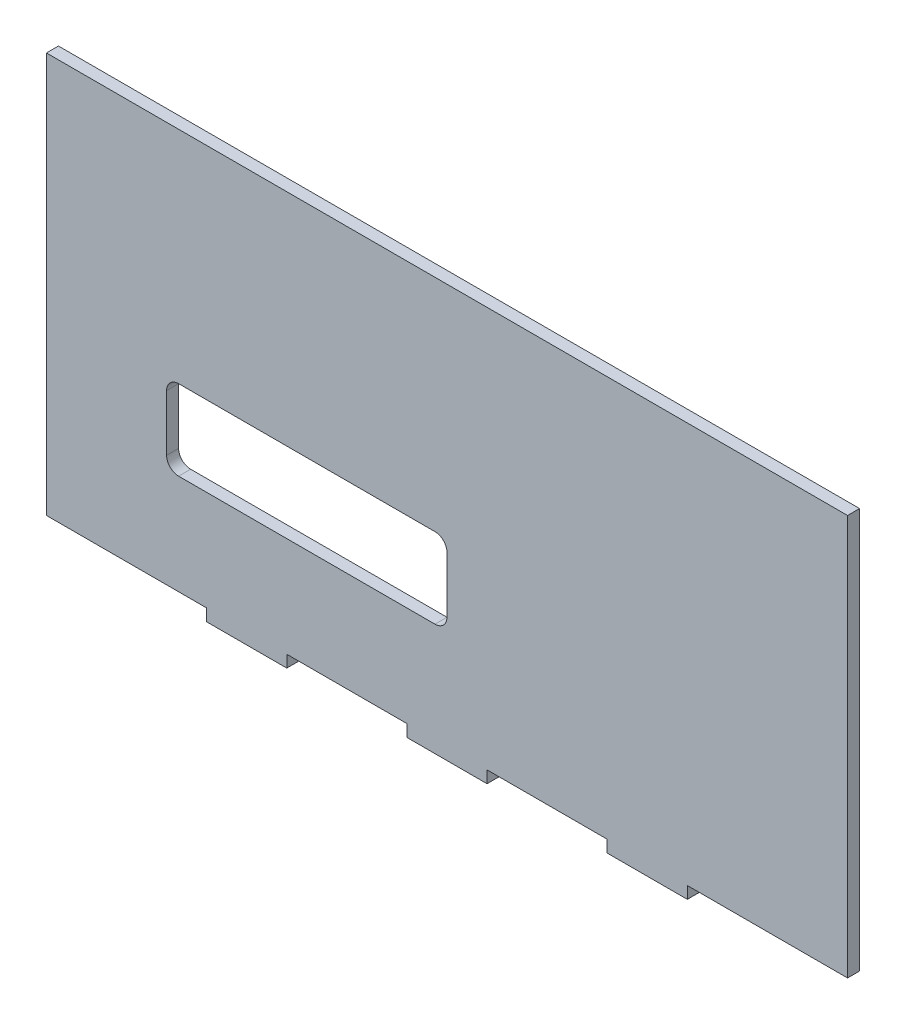
ISO-10303-21;
HEADER;
FILE_DESCRIPTION(('STEP AP214'),'2;1');
FILE_NAME('part.step','',(''),(''),'','','');
FILE_SCHEMA(('AUTOMOTIVE_DESIGN { 1 0 10303 214 1 1 1 1 }'));
ENDSEC;
DATA;
#1=APPLICATION_CONTEXT('core data for automotive mechanical design processes');
#2=APPLICATION_PROTOCOL_DEFINITION('international standard','automotive_design',2000,#1);
#3=PRODUCT_CONTEXT('',#1,'mechanical');
#4=PRODUCT('Part','Part','',(#3));
#5=PRODUCT_RELATED_PRODUCT_CATEGORY('part','',(#4));
#6=PRODUCT_DEFINITION_FORMATION('','',#4);
#7=PRODUCT_DEFINITION_CONTEXT('part definition',#1,'design');
#8=PRODUCT_DEFINITION('design','',#6,#7);
#9=PRODUCT_DEFINITION_SHAPE('','',#8);
#10=(LENGTH_UNIT() NAMED_UNIT(*) SI_UNIT(.MILLI.,.METRE.));
#11=(NAMED_UNIT(*) PLANE_ANGLE_UNIT() SI_UNIT($,.RADIAN.));
#12=(NAMED_UNIT(*) SI_UNIT($,.STERADIAN.) SOLID_ANGLE_UNIT());
#13=UNCERTAINTY_MEASURE_WITH_UNIT(LENGTH_MEASURE(1.E-05),#10,'distance_accuracy_value','');
#14=(GEOMETRIC_REPRESENTATION_CONTEXT(3) GLOBAL_UNCERTAINTY_ASSIGNED_CONTEXT((#13)) GLOBAL_UNIT_ASSIGNED_CONTEXT((#10,
#11,#12)) REPRESENTATION_CONTEXT('',''));
#15=CARTESIAN_POINT('',(0.,0.,0.));
#16=DIRECTION('',(0.,0.,1.));
#17=DIRECTION('',(1.,0.,0.));
#18=AXIS2_PLACEMENT_3D('',#15,#16,#17);
#19=CARTESIAN_POINT('',(0.,0.,3.));
#20=DIRECTION('',(0.,0.,-1.));
#21=DIRECTION('',(-1.,0.,0.));
#22=AXIS2_PLACEMENT_3D('',#19,#20,#21);
#23=PLANE('',#22);
#24=DIRECTION('',(0.,1.,0.));
#25=VECTOR('',#24,1.);
#26=CARTESIAN_POINT('',(100.,-50.,3.));
#27=LINE('',#26,#25);
#28=CARTESIAN_POINT('',(100.,-50.,3.));
#29=VERTEX_POINT('',#28);
#30=CARTESIAN_POINT('',(100.,50.,3.));
#31=VERTEX_POINT('',#30);
#32=EDGE_CURVE('E263',#29,#31,#27,.T.);
#33=ORIENTED_EDGE('',*,*,#32,.T.);
#34=DIRECTION('',(-1.,0.,0.));
#35=VECTOR('',#34,1.);
#36=CARTESIAN_POINT('',(-100.,50.,3.));
#37=LINE('',#36,#35);
#38=CARTESIAN_POINT('',(-100.,50.,3.));
#39=VERTEX_POINT('',#38);
#40=EDGE_CURVE('E266',#31,#39,#37,.T.);
#41=ORIENTED_EDGE('',*,*,#40,.T.);
#42=DIRECTION('',(0.,-1.,0.));
#43=VECTOR('',#42,1.);
#44=CARTESIAN_POINT('',(-100.,-50.,3.));
#45=LINE('',#44,#43);
#46=CARTESIAN_POINT('',(-100.,-50.,3.));
#47=VERTEX_POINT('',#46);
#48=EDGE_CURVE('E269',#39,#47,#45,.T.);
#49=ORIENTED_EDGE('',*,*,#48,.T.);
#50=DIRECTION('',(1.,0.,0.));
#51=VECTOR('',#50,1.);
#52=CARTESIAN_POINT('',(-100.,-50.,3.));
#53=LINE('',#52,#51);
#54=CARTESIAN_POINT('',(-60.,-50.,3.));
#55=VERTEX_POINT('',#54);
#56=EDGE_CURVE('E271',#47,#55,#53,.T.);
#57=ORIENTED_EDGE('',*,*,#56,.T.);
#58=DIRECTION('',(0.,-1.,0.));
#59=VECTOR('',#58,1.);
#60=CARTESIAN_POINT('',(-60.,-53.,3.));
#61=LINE('',#60,#59);
#62=CARTESIAN_POINT('',(-60.,-53.,3.));
#63=VERTEX_POINT('',#62);
#64=EDGE_CURVE('E273',#55,#63,#61,.T.);
#65=ORIENTED_EDGE('',*,*,#64,.T.);
#66=DIRECTION('',(1.,0.,0.));
#67=VECTOR('',#66,1.);
#68=CARTESIAN_POINT('',(-60.,-53.,3.));
#69=LINE('',#68,#67);
#70=CARTESIAN_POINT('',(-40.,-53.,3.));
#71=VERTEX_POINT('',#70);
#72=EDGE_CURVE('E275',#63,#71,#69,.T.);
#73=ORIENTED_EDGE('',*,*,#72,.T.);
#74=DIRECTION('',(0.,1.,0.));
#75=VECTOR('',#74,1.);
#76=CARTESIAN_POINT('',(-40.,-53.,3.));
#77=LINE('',#76,#75);
#78=CARTESIAN_POINT('',(-40.,-50.,3.));
#79=VERTEX_POINT('',#78);
#80=EDGE_CURVE('E277',#71,#79,#77,.T.);
#81=ORIENTED_EDGE('',*,*,#80,.T.);
#82=DIRECTION('',(1.,0.,0.));
#83=VECTOR('',#82,1.);
#84=CARTESIAN_POINT('',(-40.,-50.,3.));
#85=LINE('',#84,#83);
#86=CARTESIAN_POINT('',(-10.,-50.,3.));
#87=VERTEX_POINT('',#86);
#88=EDGE_CURVE('E279',#79,#87,#85,.T.);
#89=ORIENTED_EDGE('',*,*,#88,.T.);
#90=DIRECTION('',(0.,-1.,0.));
#91=VECTOR('',#90,1.);
#92=CARTESIAN_POINT('',(-10.,-53.,3.));
#93=LINE('',#92,#91);
#94=CARTESIAN_POINT('',(-10.,-53.,3.));
#95=VERTEX_POINT('',#94);
#96=EDGE_CURVE('E281',#87,#95,#93,.T.);
#97=ORIENTED_EDGE('',*,*,#96,.T.);
#98=DIRECTION('',(1.,0.,0.));
#99=VECTOR('',#98,1.);
#100=CARTESIAN_POINT('',(-10.,-53.,3.));
#101=LINE('',#100,#99);
#102=CARTESIAN_POINT('',(10.,-53.,3.));
#103=VERTEX_POINT('',#102);
#104=EDGE_CURVE('E283',#95,#103,#101,.T.);
#105=ORIENTED_EDGE('',*,*,#104,.T.);
#106=DIRECTION('',(0.,1.,0.));
#107=VECTOR('',#106,1.);
#108=CARTESIAN_POINT('',(10.,-53.,3.));
#109=LINE('',#108,#107);
#110=CARTESIAN_POINT('',(10.,-50.,3.));
#111=VERTEX_POINT('',#110);
#112=EDGE_CURVE('E285',#103,#111,#109,.T.);
#113=ORIENTED_EDGE('',*,*,#112,.T.);
#114=DIRECTION('',(1.,0.,0.));
#115=VECTOR('',#114,1.);
#116=CARTESIAN_POINT('',(10.,-50.,3.));
#117=LINE('',#116,#115);
#118=CARTESIAN_POINT('',(40.,-50.,3.));
#119=VERTEX_POINT('',#118);
#120=EDGE_CURVE('E287',#111,#119,#117,.T.);
#121=ORIENTED_EDGE('',*,*,#120,.T.);
#122=DIRECTION('',(0.,-1.,0.));
#123=VECTOR('',#122,1.);
#124=CARTESIAN_POINT('',(40.,-53.,3.));
#125=LINE('',#124,#123);
#126=CARTESIAN_POINT('',(40.,-53.,3.));
#127=VERTEX_POINT('',#126);
#128=EDGE_CURVE('E289',#119,#127,#125,.T.);
#129=ORIENTED_EDGE('',*,*,#128,.T.);
#130=DIRECTION('',(1.,0.,0.));
#131=VECTOR('',#130,1.);
#132=CARTESIAN_POINT('',(40.,-53.,3.));
#133=LINE('',#132,#131);
#134=CARTESIAN_POINT('',(60.,-53.,3.));
#135=VERTEX_POINT('',#134);
#136=EDGE_CURVE('E291',#127,#135,#133,.T.);
#137=ORIENTED_EDGE('',*,*,#136,.T.);
#138=DIRECTION('',(0.,1.,0.));
#139=VECTOR('',#138,1.);
#140=CARTESIAN_POINT('',(60.,-53.,3.));
#141=LINE('',#140,#139);
#142=CARTESIAN_POINT('',(60.,-50.,3.));
#143=VERTEX_POINT('',#142);
#144=EDGE_CURVE('E293',#135,#143,#141,.T.);
#145=ORIENTED_EDGE('',*,*,#144,.T.);
#146=DIRECTION('',(1.,0.,0.));
#147=VECTOR('',#146,1.);
#148=CARTESIAN_POINT('',(60.,-50.,3.));
#149=LINE('',#148,#147);
#150=EDGE_CURVE('E295',#143,#29,#149,.T.);
#151=ORIENTED_EDGE('',*,*,#150,.T.);
#152=EDGE_LOOP('',(#33,#41,#49,#57,#65,#73,#81,#89,#97,#105,#113,#121,#129,#137,#145,#151));
#153=FACE_BOUND('',#152,.T.);
#154=CARTESIAN_POINT('',(-67.,-8.00000000000001,3.));
#155=DIRECTION('',(0.,0.,1.));
#156=DIRECTION('',(-1.,0.,0.));
#157=AXIS2_PLACEMENT_3D('',#154,#155,#156);
#158=CIRCLE('',#157,3.);
#159=CARTESIAN_POINT('',(-67.,-5.00000000000001,3.));
#160=VERTEX_POINT('',#159);
#161=CARTESIAN_POINT('',(-70.,-8.00000000000003,3.));
#162=VERTEX_POINT('',#161);
#163=EDGE_CURVE('E198',#160,#162,#158,.T.);
#164=ORIENTED_EDGE('',*,*,#163,.F.);
#165=DIRECTION('',(-1.,0.,0.));
#166=VECTOR('',#165,1.);
#167=CARTESIAN_POINT('',(-67.,-5.00000000000001,3.));
#168=LINE('',#167,#166);
#169=CARTESIAN_POINT('',(-3.00000000000005,-5.00000000000001,3.));
#170=VERTEX_POINT('',#169);
#171=EDGE_CURVE('E231',#170,#160,#168,.T.);
#172=ORIENTED_EDGE('',*,*,#171,.F.);
#173=CARTESIAN_POINT('',(-3.00000000000003,-8.00000000000001,3.));
#174=DIRECTION('',(0.,0.,1.));
#175=DIRECTION('',(-1.,0.,0.));
#176=AXIS2_PLACEMENT_3D('',#173,#174,#175);
#177=CIRCLE('',#176,3.);
#178=CARTESIAN_POINT('',(0.,-8.00000000000003,3.));
#179=VERTEX_POINT('',#178);
#180=EDGE_CURVE('E229',#179,#170,#177,.T.);
#181=ORIENTED_EDGE('',*,*,#180,.F.);
#182=DIRECTION('',(0.,1.,0.));
#183=VECTOR('',#182,1.);
#184=CARTESIAN_POINT('',(0.,-22.,3.));
#185=LINE('',#184,#183);
#186=CARTESIAN_POINT('',(0.,-22.,3.));
#187=VERTEX_POINT('',#186);
#188=EDGE_CURVE('E227',#187,#179,#185,.T.);
#189=ORIENTED_EDGE('',*,*,#188,.F.);
#190=CARTESIAN_POINT('',(-3.00000000000003,-22.,3.));
#191=DIRECTION('',(0.,0.,1.));
#192=DIRECTION('',(1.,0.,0.));
#193=AXIS2_PLACEMENT_3D('',#190,#191,#192);
#194=CIRCLE('',#193,3.);
#195=CARTESIAN_POINT('',(-3.00000000000005,-25.,3.));
#196=VERTEX_POINT('',#195);
#197=EDGE_CURVE('E225',#196,#187,#194,.T.);
#198=ORIENTED_EDGE('',*,*,#197,.F.);
#199=DIRECTION('',(1.,0.,0.));
#200=VECTOR('',#199,1.);
#201=CARTESIAN_POINT('',(-67.,-25.,3.));
#202=LINE('',#201,#200);
#203=CARTESIAN_POINT('',(-67.,-25.,3.));
#204=VERTEX_POINT('',#203);
#205=EDGE_CURVE('E221',#204,#196,#202,.T.);
#206=ORIENTED_EDGE('',*,*,#205,.F.);
#207=CARTESIAN_POINT('',(-67.,-22.,3.));
#208=DIRECTION('',(0.,0.,1.));
#209=DIRECTION('',(1.,0.,0.));
#210=AXIS2_PLACEMENT_3D('',#207,#208,#209);
#211=CIRCLE('',#210,3.);
#212=CARTESIAN_POINT('',(-70.,-22.,3.));
#213=VERTEX_POINT('',#212);
#214=EDGE_CURVE('E219',#213,#204,#211,.T.);
#215=ORIENTED_EDGE('',*,*,#214,.F.);
#216=DIRECTION('',(0.,-1.,0.));
#217=VECTOR('',#216,1.);
#218=CARTESIAN_POINT('',(-70.,-22.,3.));
#219=LINE('',#218,#217);
#220=EDGE_CURVE('E206',#162,#213,#219,.T.);
#221=ORIENTED_EDGE('',*,*,#220,.F.);
#222=EDGE_LOOP('',(#164,#172,#181,#189,#198,#206,#215,#221));
#223=FACE_BOUND('',#222,.T.);
#224=ADVANCED_FACE('F37',(#153,#223),#23,.F.);
#225=CARTESIAN_POINT('',(0.,0.,0.));
#226=DIRECTION('',(0.,0.,-1.));
#227=DIRECTION('',(-1.,0.,0.));
#228=AXIS2_PLACEMENT_3D('',#225,#226,#227);
#229=PLANE('',#228);
#230=DIRECTION('',(0.,1.,0.));
#231=VECTOR('',#230,1.);
#232=CARTESIAN_POINT('',(100.,-50.,0.));
#233=LINE('',#232,#231);
#234=CARTESIAN_POINT('',(100.,-50.,0.));
#235=VERTEX_POINT('',#234);
#236=CARTESIAN_POINT('',(100.,50.,0.));
#237=VERTEX_POINT('',#236);
#238=EDGE_CURVE('E214',#235,#237,#233,.T.);
#239=ORIENTED_EDGE('',*,*,#238,.F.);
#240=DIRECTION('',(1.,0.,0.));
#241=VECTOR('',#240,1.);
#242=CARTESIAN_POINT('',(60.,-50.,0.));
#243=LINE('',#242,#241);
#244=CARTESIAN_POINT('',(60.,-50.,0.));
#245=VERTEX_POINT('',#244);
#246=EDGE_CURVE('E267',#245,#235,#243,.T.);
#247=ORIENTED_EDGE('',*,*,#246,.F.);
#248=DIRECTION('',(0.,1.,0.));
#249=VECTOR('',#248,1.);
#250=CARTESIAN_POINT('',(60.,-53.,0.));
#251=LINE('',#250,#249);
#252=CARTESIAN_POINT('',(60.,-53.,0.));
#253=VERTEX_POINT('',#252);
#254=EDGE_CURVE('E326',#253,#245,#251,.T.);
#255=ORIENTED_EDGE('',*,*,#254,.F.);
#256=DIRECTION('',(1.,0.,0.));
#257=VECTOR('',#256,1.);
#258=CARTESIAN_POINT('',(40.,-53.,0.));
#259=LINE('',#258,#257);
#260=CARTESIAN_POINT('',(40.,-53.,0.));
#261=VERTEX_POINT('',#260);
#262=EDGE_CURVE('E324',#261,#253,#259,.T.);
#263=ORIENTED_EDGE('',*,*,#262,.F.);
#264=DIRECTION('',(0.,-1.,0.));
#265=VECTOR('',#264,1.);
#266=CARTESIAN_POINT('',(40.,-53.,0.));
#267=LINE('',#266,#265);
#268=CARTESIAN_POINT('',(40.,-50.,0.));
#269=VERTEX_POINT('',#268);
#270=EDGE_CURVE('E322',#269,#261,#267,.T.);
#271=ORIENTED_EDGE('',*,*,#270,.F.);
#272=DIRECTION('',(1.,0.,0.));
#273=VECTOR('',#272,1.);
#274=CARTESIAN_POINT('',(10.,-50.,0.));
#275=LINE('',#274,#273);
#276=CARTESIAN_POINT('',(10.,-50.,0.));
#277=VERTEX_POINT('',#276);
#278=EDGE_CURVE('E320',#277,#269,#275,.T.);
#279=ORIENTED_EDGE('',*,*,#278,.F.);
#280=DIRECTION('',(0.,1.,0.));
#281=VECTOR('',#280,1.);
#282=CARTESIAN_POINT('',(10.,-53.,0.));
#283=LINE('',#282,#281);
#284=CARTESIAN_POINT('',(10.,-53.,0.));
#285=VERTEX_POINT('',#284);
#286=EDGE_CURVE('E318',#285,#277,#283,.T.);
#287=ORIENTED_EDGE('',*,*,#286,.F.);
#288=DIRECTION('',(1.,0.,0.));
#289=VECTOR('',#288,1.);
#290=CARTESIAN_POINT('',(-10.,-53.,0.));
#291=LINE('',#290,#289);
#292=CARTESIAN_POINT('',(-10.,-53.,0.));
#293=VERTEX_POINT('',#292);
#294=EDGE_CURVE('E316',#293,#285,#291,.T.);
#295=ORIENTED_EDGE('',*,*,#294,.F.);
#296=DIRECTION('',(0.,-1.,0.));
#297=VECTOR('',#296,1.);
#298=CARTESIAN_POINT('',(-10.,-53.,0.));
#299=LINE('',#298,#297);
#300=CARTESIAN_POINT('',(-10.,-50.,0.));
#301=VERTEX_POINT('',#300);
#302=EDGE_CURVE('E314',#301,#293,#299,.T.);
#303=ORIENTED_EDGE('',*,*,#302,.F.);
#304=DIRECTION('',(1.,0.,0.));
#305=VECTOR('',#304,1.);
#306=CARTESIAN_POINT('',(-40.,-50.,0.));
#307=LINE('',#306,#305);
#308=CARTESIAN_POINT('',(-40.,-50.,0.));
#309=VERTEX_POINT('',#308);
#310=EDGE_CURVE('E312',#309,#301,#307,.T.);
#311=ORIENTED_EDGE('',*,*,#310,.F.);
#312=DIRECTION('',(0.,1.,0.));
#313=VECTOR('',#312,1.);
#314=CARTESIAN_POINT('',(-40.,-53.,0.));
#315=LINE('',#314,#313);
#316=CARTESIAN_POINT('',(-40.,-53.,0.));
#317=VERTEX_POINT('',#316);
#318=EDGE_CURVE('E310',#317,#309,#315,.T.);
#319=ORIENTED_EDGE('',*,*,#318,.F.);
#320=DIRECTION('',(1.,0.,0.));
#321=VECTOR('',#320,1.);
#322=CARTESIAN_POINT('',(-60.,-53.,0.));
#323=LINE('',#322,#321);
#324=CARTESIAN_POINT('',(-60.,-53.,0.));
#325=VERTEX_POINT('',#324);
#326=EDGE_CURVE('E308',#325,#317,#323,.T.);
#327=ORIENTED_EDGE('',*,*,#326,.F.);
#328=DIRECTION('',(0.,-1.,0.));
#329=VECTOR('',#328,1.);
#330=CARTESIAN_POINT('',(-60.,-53.,0.));
#331=LINE('',#330,#329);
#332=CARTESIAN_POINT('',(-60.,-50.,0.));
#333=VERTEX_POINT('',#332);
#334=EDGE_CURVE('E306',#333,#325,#331,.T.);
#335=ORIENTED_EDGE('',*,*,#334,.F.);
#336=DIRECTION('',(1.,0.,0.));
#337=VECTOR('',#336,1.);
#338=CARTESIAN_POINT('',(-100.,-50.,0.));
#339=LINE('',#338,#337);
#340=CARTESIAN_POINT('',(-100.,-50.,0.));
#341=VERTEX_POINT('',#340);
#342=EDGE_CURVE('E304',#341,#333,#339,.T.);
#343=ORIENTED_EDGE('',*,*,#342,.F.);
#344=DIRECTION('',(0.,-1.,0.));
#345=VECTOR('',#344,1.);
#346=CARTESIAN_POINT('',(-100.,-50.,0.));
#347=LINE('',#346,#345);
#348=CARTESIAN_POINT('',(-100.,50.,0.));
#349=VERTEX_POINT('',#348);
#350=EDGE_CURVE('E302',#349,#341,#347,.T.);
#351=ORIENTED_EDGE('',*,*,#350,.F.);
#352=DIRECTION('',(-1.,0.,0.));
#353=VECTOR('',#352,1.);
#354=CARTESIAN_POINT('',(-100.,50.,0.));
#355=LINE('',#354,#353);
#356=EDGE_CURVE('E300',#237,#349,#355,.T.);
#357=ORIENTED_EDGE('',*,*,#356,.F.);
#358=EDGE_LOOP('',(#239,#247,#255,#263,#271,#279,#287,#295,#303,#311,#319,#327,#335,#343,#351,#357));
#359=FACE_BOUND('',#358,.T.);
#360=DIRECTION('',(-1.,0.,0.));
#361=VECTOR('',#360,1.);
#362=CARTESIAN_POINT('',(-67.,-5.00000000000001,0.));
#363=LINE('',#362,#361);
#364=CARTESIAN_POINT('',(-3.00000000000005,-5.00000000000001,0.));
#365=VERTEX_POINT('',#364);
#366=CARTESIAN_POINT('',(-67.,-5.00000000000001,0.));
#367=VERTEX_POINT('',#366);
#368=EDGE_CURVE('E207',#365,#367,#363,.T.);
#369=ORIENTED_EDGE('',*,*,#368,.T.);
#370=CARTESIAN_POINT('',(-67.,-8.00000000000001,0.));
#371=DIRECTION('',(0.,0.,1.));
#372=DIRECTION('',(-1.,0.,0.));
#373=AXIS2_PLACEMENT_3D('',#370,#371,#372);
#374=CIRCLE('',#373,3.);
#375=CARTESIAN_POINT('',(-70.,-8.00000000000003,0.));
#376=VERTEX_POINT('',#375);
#377=EDGE_CURVE('E60',#367,#376,#374,.T.);
#378=ORIENTED_EDGE('',*,*,#377,.T.);
#379=DIRECTION('',(0.,-1.,0.));
#380=VECTOR('',#379,1.);
#381=CARTESIAN_POINT('',(-70.,-22.,0.));
#382=LINE('',#381,#380);
#383=CARTESIAN_POINT('',(-70.,-22.,0.));
#384=VERTEX_POINT('',#383);
#385=EDGE_CURVE('E213',#376,#384,#382,.T.);
#386=ORIENTED_EDGE('',*,*,#385,.T.);
#387=CARTESIAN_POINT('',(-67.,-22.,0.));
#388=DIRECTION('',(0.,0.,1.));
#389=DIRECTION('',(1.,0.,0.));
#390=AXIS2_PLACEMENT_3D('',#387,#388,#389);
#391=CIRCLE('',#390,3.);
#392=CARTESIAN_POINT('',(-67.,-25.,0.));
#393=VERTEX_POINT('',#392);
#394=EDGE_CURVE('E235',#384,#393,#391,.T.);
#395=ORIENTED_EDGE('',*,*,#394,.T.);
#396=DIRECTION('',(1.,0.,0.));
#397=VECTOR('',#396,1.);
#398=CARTESIAN_POINT('',(-67.,-25.,0.));
#399=LINE('',#398,#397);
#400=CARTESIAN_POINT('',(-3.00000000000005,-25.,0.));
#401=VERTEX_POINT('',#400);
#402=EDGE_CURVE('E238',#393,#401,#399,.T.);
#403=ORIENTED_EDGE('',*,*,#402,.T.);
#404=CARTESIAN_POINT('',(-3.00000000000003,-22.,0.));
#405=DIRECTION('',(0.,0.,1.));
#406=DIRECTION('',(1.,0.,0.));
#407=AXIS2_PLACEMENT_3D('',#404,#405,#406);
#408=CIRCLE('',#407,3.);
#409=CARTESIAN_POINT('',(0.,-22.,0.));
#410=VERTEX_POINT('',#409);
#411=EDGE_CURVE('E241',#401,#410,#408,.T.);
#412=ORIENTED_EDGE('',*,*,#411,.T.);
#413=DIRECTION('',(0.,1.,0.));
#414=VECTOR('',#413,1.);
#415=CARTESIAN_POINT('',(0.,-22.,0.));
#416=LINE('',#415,#414);
#417=CARTESIAN_POINT('',(0.,-8.00000000000003,0.));
#418=VERTEX_POINT('',#417);
#419=EDGE_CURVE('E244',#410,#418,#416,.T.);
#420=ORIENTED_EDGE('',*,*,#419,.T.);
#421=CARTESIAN_POINT('',(-3.00000000000003,-8.00000000000001,0.));
#422=DIRECTION('',(0.,0.,1.));
#423=DIRECTION('',(-1.,0.,0.));
#424=AXIS2_PLACEMENT_3D('',#421,#422,#423);
#425=CIRCLE('',#424,3.);
#426=EDGE_CURVE('E247',#418,#365,#425,.T.);
#427=ORIENTED_EDGE('',*,*,#426,.T.);
#428=EDGE_LOOP('',(#369,#378,#386,#395,#403,#412,#420,#427));
#429=FACE_BOUND('',#428,.T.);
#430=ADVANCED_FACE('F380',(#359,#429),#229,.T.);
#431=CARTESIAN_POINT('',(100.,-50.,3.));
#432=DIRECTION('',(-1.,0.,0.));
#433=DIRECTION('',(0.,0.,1.));
#434=AXIS2_PLACEMENT_3D('',#431,#432,#433);
#435=PLANE('',#434);
#436=ORIENTED_EDGE('',*,*,#238,.T.);
#437=DIRECTION('',(0.,0.,-1.));
#438=VECTOR('',#437,1.);
#439=CARTESIAN_POINT('',(100.,50.,3.));
#440=LINE('',#439,#438);
#441=EDGE_CURVE('E11',#31,#237,#440,.T.);
#442=ORIENTED_EDGE('',*,*,#441,.F.);
#443=ORIENTED_EDGE('',*,*,#32,.F.);
#444=DIRECTION('',(0.,0.,-1.));
#445=VECTOR('',#444,1.);
#446=CARTESIAN_POINT('',(100.,-50.,3.));
#447=LINE('',#446,#445);
#448=EDGE_CURVE('E297',#29,#235,#447,.T.);
#449=ORIENTED_EDGE('',*,*,#448,.T.);
#450=EDGE_LOOP('',(#436,#442,#443,#449));
#451=FACE_BOUND('',#450,.T.);
#452=ADVANCED_FACE('F39',(#451),#435,.F.);
#453=CARTESIAN_POINT('',(-100.,50.,3.));
#454=DIRECTION('',(0.,-1.,0.));
#455=DIRECTION('',(0.,0.,-1.));
#456=AXIS2_PLACEMENT_3D('',#453,#454,#455);
#457=PLANE('',#456);
#458=ORIENTED_EDGE('',*,*,#356,.T.);
#459=DIRECTION('',(0.,0.,-1.));
#460=VECTOR('',#459,1.);
#461=CARTESIAN_POINT('',(-100.,50.,3.));
#462=LINE('',#461,#460);
#463=EDGE_CURVE('E45',#39,#349,#462,.T.);
#464=ORIENTED_EDGE('',*,*,#463,.F.);
#465=ORIENTED_EDGE('',*,*,#40,.F.);
#466=ORIENTED_EDGE('',*,*,#441,.T.);
#467=EDGE_LOOP('',(#458,#464,#465,#466));
#468=FACE_BOUND('',#467,.T.);
#469=ADVANCED_FACE('F397',(#468),#457,.F.);
#470=CARTESIAN_POINT('',(-100.,-50.,3.));
#471=DIRECTION('',(1.,0.,0.));
#472=DIRECTION('',(0.,0.,-1.));
#473=AXIS2_PLACEMENT_3D('',#470,#471,#472);
#474=PLANE('',#473);
#475=ORIENTED_EDGE('',*,*,#350,.T.);
#476=DIRECTION('',(0.,0.,-1.));
#477=VECTOR('',#476,1.);
#478=CARTESIAN_POINT('',(-100.,-50.,3.));
#479=LINE('',#478,#477);
#480=EDGE_CURVE('E367',#47,#341,#479,.T.);
#481=ORIENTED_EDGE('',*,*,#480,.F.);
#482=ORIENTED_EDGE('',*,*,#48,.F.);
#483=ORIENTED_EDGE('',*,*,#463,.T.);
#484=EDGE_LOOP('',(#475,#481,#482,#483));
#485=FACE_BOUND('',#484,.T.);
#486=ADVANCED_FACE('F374',(#485),#474,.F.);
#487=CARTESIAN_POINT('',(-100.,-50.,3.));
#488=DIRECTION('',(0.,1.,0.));
#489=DIRECTION('',(0.,0.,1.));
#490=AXIS2_PLACEMENT_3D('',#487,#488,#489);
#491=PLANE('',#490);
#492=ORIENTED_EDGE('',*,*,#342,.T.);
#493=DIRECTION('',(0.,0.,-1.));
#494=VECTOR('',#493,1.);
#495=CARTESIAN_POINT('',(-60.,-50.,3.));
#496=LINE('',#495,#494);
#497=EDGE_CURVE('E364',#55,#333,#496,.T.);
#498=ORIENTED_EDGE('',*,*,#497,.F.);
#499=ORIENTED_EDGE('',*,*,#56,.F.);
#500=ORIENTED_EDGE('',*,*,#480,.T.);
#501=EDGE_LOOP('',(#492,#498,#499,#500));
#502=FACE_BOUND('',#501,.T.);
#503=ADVANCED_FACE('F386',(#502),#491,.F.);
#504=CARTESIAN_POINT('',(-60.,-53.,3.));
#505=DIRECTION('',(1.,0.,0.));
#506=DIRECTION('',(0.,0.,-1.));
#507=AXIS2_PLACEMENT_3D('',#504,#505,#506);
#508=PLANE('',#507);
#509=ORIENTED_EDGE('',*,*,#334,.T.);
#510=DIRECTION('',(0.,0.,-1.));
#511=VECTOR('',#510,1.);
#512=CARTESIAN_POINT('',(-60.,-53.,3.));
#513=LINE('',#512,#511);
#514=EDGE_CURVE('E361',#63,#325,#513,.T.);
#515=ORIENTED_EDGE('',*,*,#514,.F.);
#516=ORIENTED_EDGE('',*,*,#64,.F.);
#517=ORIENTED_EDGE('',*,*,#497,.T.);
#518=EDGE_LOOP('',(#509,#515,#516,#517));
#519=FACE_BOUND('',#518,.T.);
#520=ADVANCED_FACE('F390',(#519),#508,.F.);
#521=CARTESIAN_POINT('',(-60.,-53.,3.));
#522=DIRECTION('',(0.,1.,0.));
#523=DIRECTION('',(-1.,0.,0.));
#524=AXIS2_PLACEMENT_3D('',#521,#522,#523);
#525=PLANE('',#524);
#526=ORIENTED_EDGE('',*,*,#326,.T.);
#527=DIRECTION('',(0.,0.,-1.));
#528=VECTOR('',#527,1.);
#529=CARTESIAN_POINT('',(-40.,-53.,3.));
#530=LINE('',#529,#528);
#531=EDGE_CURVE('E358',#71,#317,#530,.T.);
#532=ORIENTED_EDGE('',*,*,#531,.F.);
#533=ORIENTED_EDGE('',*,*,#72,.F.);
#534=ORIENTED_EDGE('',*,*,#514,.T.);
#535=EDGE_LOOP('',(#526,#532,#533,#534));
#536=FACE_BOUND('',#535,.T.);
#537=ADVANCED_FACE('F450',(#536),#525,.F.);
#538=CARTESIAN_POINT('',(-40.,-53.,3.));
#539=DIRECTION('',(-1.,0.,0.));
#540=DIRECTION('',(0.,0.,1.));
#541=AXIS2_PLACEMENT_3D('',#538,#539,#540);
#542=PLANE('',#541);
#543=ORIENTED_EDGE('',*,*,#318,.T.);
#544=DIRECTION('',(0.,0.,-1.));
#545=VECTOR('',#544,1.);
#546=CARTESIAN_POINT('',(-40.,-50.,3.));
#547=LINE('',#546,#545);
#548=EDGE_CURVE('E355',#79,#309,#547,.T.);
#549=ORIENTED_EDGE('',*,*,#548,.F.);
#550=ORIENTED_EDGE('',*,*,#80,.F.);
#551=ORIENTED_EDGE('',*,*,#531,.T.);
#552=EDGE_LOOP('',(#543,#549,#550,#551));
#553=FACE_BOUND('',#552,.T.);
#554=ADVANCED_FACE('F447',(#553),#542,.F.);
#555=CARTESIAN_POINT('',(-40.,-50.,3.));
#556=DIRECTION('',(0.,1.,0.));
#557=DIRECTION('',(0.,0.,1.));
#558=AXIS2_PLACEMENT_3D('',#555,#556,#557);
#559=PLANE('',#558);
#560=ORIENTED_EDGE('',*,*,#310,.T.);
#561=DIRECTION('',(0.,0.,-1.));
#562=VECTOR('',#561,1.);
#563=CARTESIAN_POINT('',(-10.,-50.,3.));
#564=LINE('',#563,#562);
#565=EDGE_CURVE('E352',#87,#301,#564,.T.);
#566=ORIENTED_EDGE('',*,*,#565,.F.);
#567=ORIENTED_EDGE('',*,*,#88,.F.);
#568=ORIENTED_EDGE('',*,*,#548,.T.);
#569=EDGE_LOOP('',(#560,#566,#567,#568));
#570=FACE_BOUND('',#569,.T.);
#571=ADVANCED_FACE('F443',(#570),#559,.F.);
#572=CARTESIAN_POINT('',(-10.,-53.,3.));
#573=DIRECTION('',(1.,0.,0.));
#574=DIRECTION('',(0.,0.,-1.));
#575=AXIS2_PLACEMENT_3D('',#572,#573,#574);
#576=PLANE('',#575);
#577=ORIENTED_EDGE('',*,*,#302,.T.);
#578=DIRECTION('',(0.,0.,-1.));
#579=VECTOR('',#578,1.);
#580=CARTESIAN_POINT('',(-10.,-53.,3.));
#581=LINE('',#580,#579);
#582=EDGE_CURVE('E349',#95,#293,#581,.T.);
#583=ORIENTED_EDGE('',*,*,#582,.F.);
#584=ORIENTED_EDGE('',*,*,#96,.F.);
#585=ORIENTED_EDGE('',*,*,#565,.T.);
#586=EDGE_LOOP('',(#577,#583,#584,#585));
#587=FACE_BOUND('',#586,.T.);
#588=ADVANCED_FACE('F439',(#587),#576,.F.);
#589=CARTESIAN_POINT('',(-10.,-53.,3.));
#590=DIRECTION('',(0.,1.,0.));
#591=DIRECTION('',(0.,0.,1.));
#592=AXIS2_PLACEMENT_3D('',#589,#590,#591);
#593=PLANE('',#592);
#594=ORIENTED_EDGE('',*,*,#294,.T.);
#595=DIRECTION('',(0.,0.,-1.));
#596=VECTOR('',#595,1.);
#597=CARTESIAN_POINT('',(10.,-53.,3.));
#598=LINE('',#597,#596);
#599=EDGE_CURVE('E346',#103,#285,#598,.T.);
#600=ORIENTED_EDGE('',*,*,#599,.F.);
#601=ORIENTED_EDGE('',*,*,#104,.F.);
#602=ORIENTED_EDGE('',*,*,#582,.T.);
#603=EDGE_LOOP('',(#594,#600,#601,#602));
#604=FACE_BOUND('',#603,.T.);
#605=ADVANCED_FACE('F434',(#604),#593,.F.);
#606=CARTESIAN_POINT('',(10.,-53.,3.));
#607=DIRECTION('',(-1.,0.,0.));
#608=DIRECTION('',(0.,0.,1.));
#609=AXIS2_PLACEMENT_3D('',#606,#607,#608);
#610=PLANE('',#609);
#611=ORIENTED_EDGE('',*,*,#286,.T.);
#612=DIRECTION('',(0.,0.,-1.));
#613=VECTOR('',#612,1.);
#614=CARTESIAN_POINT('',(10.,-50.,3.));
#615=LINE('',#614,#613);
#616=EDGE_CURVE('E343',#111,#277,#615,.T.);
#617=ORIENTED_EDGE('',*,*,#616,.F.);
#618=ORIENTED_EDGE('',*,*,#112,.F.);
#619=ORIENTED_EDGE('',*,*,#599,.T.);
#620=EDGE_LOOP('',(#611,#617,#618,#619));
#621=FACE_BOUND('',#620,.T.);
#622=ADVANCED_FACE('F428',(#621),#610,.F.);
#623=CARTESIAN_POINT('',(10.,-50.,3.));
#624=DIRECTION('',(0.,1.,0.));
#625=DIRECTION('',(0.,0.,1.));
#626=AXIS2_PLACEMENT_3D('',#623,#624,#625);
#627=PLANE('',#626);
#628=ORIENTED_EDGE('',*,*,#278,.T.);
#629=DIRECTION('',(0.,0.,-1.));
#630=VECTOR('',#629,1.);
#631=CARTESIAN_POINT('',(40.,-50.,3.));
#632=LINE('',#631,#630);
#633=EDGE_CURVE('E340',#119,#269,#632,.T.);
#634=ORIENTED_EDGE('',*,*,#633,.F.);
#635=ORIENTED_EDGE('',*,*,#120,.F.);
#636=ORIENTED_EDGE('',*,*,#616,.T.);
#637=EDGE_LOOP('',(#628,#634,#635,#636));
#638=FACE_BOUND('',#637,.T.);
#639=ADVANCED_FACE('F424',(#638),#627,.F.);
#640=CARTESIAN_POINT('',(40.,-53.,3.));
#641=DIRECTION('',(1.,0.,0.));
#642=DIRECTION('',(0.,0.,-1.));
#643=AXIS2_PLACEMENT_3D('',#640,#641,#642);
#644=PLANE('',#643);
#645=ORIENTED_EDGE('',*,*,#270,.T.);
#646=DIRECTION('',(0.,0.,-1.));
#647=VECTOR('',#646,1.);
#648=CARTESIAN_POINT('',(40.,-53.,3.));
#649=LINE('',#648,#647);
#650=EDGE_CURVE('E337',#127,#261,#649,.T.);
#651=ORIENTED_EDGE('',*,*,#650,.F.);
#652=ORIENTED_EDGE('',*,*,#128,.F.);
#653=ORIENTED_EDGE('',*,*,#633,.T.);
#654=EDGE_LOOP('',(#645,#651,#652,#653));
#655=FACE_BOUND('',#654,.T.);
#656=ADVANCED_FACE('F419',(#655),#644,.F.);
#657=CARTESIAN_POINT('',(40.,-53.,3.));
#658=DIRECTION('',(0.,1.,0.));
#659=DIRECTION('',(0.,0.,1.));
#660=AXIS2_PLACEMENT_3D('',#657,#658,#659);
#661=PLANE('',#660);
#662=ORIENTED_EDGE('',*,*,#262,.T.);
#663=DIRECTION('',(0.,0.,-1.));
#664=VECTOR('',#663,1.);
#665=CARTESIAN_POINT('',(60.,-53.,3.));
#666=LINE('',#665,#664);
#667=EDGE_CURVE('E334',#135,#253,#666,.T.);
#668=ORIENTED_EDGE('',*,*,#667,.F.);
#669=ORIENTED_EDGE('',*,*,#136,.F.);
#670=ORIENTED_EDGE('',*,*,#650,.T.);
#671=EDGE_LOOP('',(#662,#668,#669,#670));
#672=FACE_BOUND('',#671,.T.);
#673=ADVANCED_FACE('F413',(#672),#661,.F.);
#674=CARTESIAN_POINT('',(60.,-53.,3.));
#675=DIRECTION('',(-1.,0.,0.));
#676=DIRECTION('',(0.,0.,1.));
#677=AXIS2_PLACEMENT_3D('',#674,#675,#676);
#678=PLANE('',#677);
#679=ORIENTED_EDGE('',*,*,#254,.T.);
#680=DIRECTION('',(0.,0.,-1.));
#681=VECTOR('',#680,1.);
#682=CARTESIAN_POINT('',(60.,-50.,3.));
#683=LINE('',#682,#681);
#684=EDGE_CURVE('E331',#143,#245,#683,.T.);
#685=ORIENTED_EDGE('',*,*,#684,.F.);
#686=ORIENTED_EDGE('',*,*,#144,.F.);
#687=ORIENTED_EDGE('',*,*,#667,.T.);
#688=EDGE_LOOP('',(#679,#685,#686,#687));
#689=FACE_BOUND('',#688,.T.);
#690=ADVANCED_FACE('F409',(#689),#678,.F.);
#691=CARTESIAN_POINT('',(60.,-50.,3.));
#692=DIRECTION('',(0.,1.,0.));
#693=DIRECTION('',(0.,0.,1.));
#694=AXIS2_PLACEMENT_3D('',#691,#692,#693);
#695=PLANE('',#694);
#696=ORIENTED_EDGE('',*,*,#246,.T.);
#697=ORIENTED_EDGE('',*,*,#448,.F.);
#698=ORIENTED_EDGE('',*,*,#150,.F.);
#699=ORIENTED_EDGE('',*,*,#684,.T.);
#700=EDGE_LOOP('',(#696,#697,#698,#699));
#701=FACE_BOUND('',#700,.T.);
#702=ADVANCED_FACE('F404',(#701),#695,.F.);
#703=CARTESIAN_POINT('',(-67.,-8.00000000000001,3.));
#704=DIRECTION('',(0.,0.,-1.));
#705=DIRECTION('',(-1.,0.,0.));
#706=AXIS2_PLACEMENT_3D('',#703,#704,#705);
#707=CYLINDRICAL_SURFACE('',#706,3.);
#708=ORIENTED_EDGE('',*,*,#377,.F.);
#709=DIRECTION('',(0.,0.,-1.));
#710=VECTOR('',#709,1.);
#711=CARTESIAN_POINT('',(-67.,-5.00000000000001,3.));
#712=LINE('',#711,#710);
#713=EDGE_CURVE('E202',#160,#367,#712,.T.);
#714=ORIENTED_EDGE('',*,*,#713,.F.);
#715=ORIENTED_EDGE('',*,*,#163,.T.);
#716=DIRECTION('',(0.,0.,-1.));
#717=VECTOR('',#716,1.);
#718=CARTESIAN_POINT('',(-70.,-8.00000000000003,3.));
#719=LINE('',#718,#717);
#720=EDGE_CURVE('E201',#162,#376,#719,.T.);
#721=ORIENTED_EDGE('',*,*,#720,.T.);
#722=EDGE_LOOP('',(#708,#714,#715,#721));
#723=FACE_BOUND('',#722,.T.);
#724=ADVANCED_FACE('F200',(#723),#707,.F.);
#725=CARTESIAN_POINT('',(-70.,-22.,3.));
#726=DIRECTION('',(1.,0.,0.));
#727=DIRECTION('',(0.,0.,-1.));
#728=AXIS2_PLACEMENT_3D('',#725,#726,#727);
#729=PLANE('',#728);
#730=ORIENTED_EDGE('',*,*,#385,.F.);
#731=ORIENTED_EDGE('',*,*,#720,.F.);
#732=ORIENTED_EDGE('',*,*,#220,.T.);
#733=DIRECTION('',(0.,0.,-1.));
#734=VECTOR('',#733,1.);
#735=CARTESIAN_POINT('',(-70.,-22.,3.));
#736=LINE('',#735,#734);
#737=EDGE_CURVE('E215',#213,#384,#736,.T.);
#738=ORIENTED_EDGE('',*,*,#737,.T.);
#739=EDGE_LOOP('',(#730,#731,#732,#738));
#740=FACE_BOUND('',#739,.T.);
#741=ADVANCED_FACE('F210',(#740),#729,.T.);
#742=CARTESIAN_POINT('',(-67.,-22.,3.));
#743=DIRECTION('',(0.,0.,-1.));
#744=DIRECTION('',(-1.,0.,0.));
#745=AXIS2_PLACEMENT_3D('',#742,#743,#744);
#746=CYLINDRICAL_SURFACE('',#745,3.);
#747=ORIENTED_EDGE('',*,*,#394,.F.);
#748=ORIENTED_EDGE('',*,*,#737,.F.);
#749=ORIENTED_EDGE('',*,*,#214,.T.);
#750=DIRECTION('',(0.,0.,-1.));
#751=VECTOR('',#750,1.);
#752=CARTESIAN_POINT('',(-67.,-25.,3.));
#753=LINE('',#752,#751);
#754=EDGE_CURVE('E260',#204,#393,#753,.T.);
#755=ORIENTED_EDGE('',*,*,#754,.T.);
#756=EDGE_LOOP('',(#747,#748,#749,#755));
#757=FACE_BOUND('',#756,.T.);
#758=ADVANCED_FACE('F532',(#757),#746,.F.);
#759=CARTESIAN_POINT('',(-67.,-25.,3.));
#760=DIRECTION('',(0.,1.,0.));
#761=DIRECTION('',(0.,0.,1.));
#762=AXIS2_PLACEMENT_3D('',#759,#760,#761);
#763=PLANE('',#762);
#764=ORIENTED_EDGE('',*,*,#402,.F.);
#765=ORIENTED_EDGE('',*,*,#754,.F.);
#766=ORIENTED_EDGE('',*,*,#205,.T.);
#767=DIRECTION('',(0.,0.,-1.));
#768=VECTOR('',#767,1.);
#769=CARTESIAN_POINT('',(-3.00000000000005,-25.,3.));
#770=LINE('',#769,#768);
#771=EDGE_CURVE('E258',#196,#401,#770,.T.);
#772=ORIENTED_EDGE('',*,*,#771,.T.);
#773=EDGE_LOOP('',(#764,#765,#766,#772));
#774=FACE_BOUND('',#773,.T.);
#775=ADVANCED_FACE('F538',(#774),#763,.T.);
#776=CARTESIAN_POINT('',(-3.00000000000003,-22.,3.));
#777=DIRECTION('',(0.,0.,-1.));
#778=DIRECTION('',(-1.,0.,0.));
#779=AXIS2_PLACEMENT_3D('',#776,#777,#778);
#780=CYLINDRICAL_SURFACE('',#779,3.);
#781=ORIENTED_EDGE('',*,*,#411,.F.);
#782=ORIENTED_EDGE('',*,*,#771,.F.);
#783=ORIENTED_EDGE('',*,*,#197,.T.);
#784=DIRECTION('',(0.,0.,-1.));
#785=VECTOR('',#784,1.);
#786=CARTESIAN_POINT('',(0.,-22.,3.));
#787=LINE('',#786,#785);
#788=EDGE_CURVE('E256',#187,#410,#787,.T.);
#789=ORIENTED_EDGE('',*,*,#788,.T.);
#790=EDGE_LOOP('',(#781,#782,#783,#789));
#791=FACE_BOUND('',#790,.T.);
#792=ADVANCED_FACE('F546',(#791),#780,.F.);
#793=CARTESIAN_POINT('',(0.,-22.,3.));
#794=DIRECTION('',(-1.,0.,0.));
#795=DIRECTION('',(0.,0.,1.));
#796=AXIS2_PLACEMENT_3D('',#793,#794,#795);
#797=PLANE('',#796);
#798=ORIENTED_EDGE('',*,*,#419,.F.);
#799=ORIENTED_EDGE('',*,*,#788,.F.);
#800=ORIENTED_EDGE('',*,*,#188,.T.);
#801=DIRECTION('',(0.,0.,-1.));
#802=VECTOR('',#801,1.);
#803=CARTESIAN_POINT('',(0.,-8.00000000000003,3.));
#804=LINE('',#803,#802);
#805=EDGE_CURVE('E254',#179,#418,#804,.T.);
#806=ORIENTED_EDGE('',*,*,#805,.T.);
#807=EDGE_LOOP('',(#798,#799,#800,#806));
#808=FACE_BOUND('',#807,.T.);
#809=ADVANCED_FACE('F554',(#808),#797,.T.);
#810=CARTESIAN_POINT('',(-3.00000000000003,-8.00000000000001,3.));
#811=DIRECTION('',(0.,0.,-1.));
#812=DIRECTION('',(-1.,0.,0.));
#813=AXIS2_PLACEMENT_3D('',#810,#811,#812);
#814=CYLINDRICAL_SURFACE('',#813,3.);
#815=ORIENTED_EDGE('',*,*,#426,.F.);
#816=ORIENTED_EDGE('',*,*,#805,.F.);
#817=ORIENTED_EDGE('',*,*,#180,.T.);
#818=DIRECTION('',(0.,0.,-1.));
#819=VECTOR('',#818,1.);
#820=CARTESIAN_POINT('',(-3.00000000000005,-5.00000000000001,3.));
#821=LINE('',#820,#819);
#822=EDGE_CURVE('E52',#170,#365,#821,.T.);
#823=ORIENTED_EDGE('',*,*,#822,.T.);
#824=EDGE_LOOP('',(#815,#816,#817,#823));
#825=FACE_BOUND('',#824,.T.);
#826=ADVANCED_FACE('F562',(#825),#814,.F.);
#827=CARTESIAN_POINT('',(-67.,-5.00000000000001,3.));
#828=DIRECTION('',(0.,-1.,0.));
#829=DIRECTION('',(0.,0.,-1.));
#830=AXIS2_PLACEMENT_3D('',#827,#828,#829);
#831=PLANE('',#830);
#832=ORIENTED_EDGE('',*,*,#368,.F.);
#833=ORIENTED_EDGE('',*,*,#822,.F.);
#834=ORIENTED_EDGE('',*,*,#171,.T.);
#835=ORIENTED_EDGE('',*,*,#713,.T.);
#836=EDGE_LOOP('',(#832,#833,#834,#835));
#837=FACE_BOUND('',#836,.T.);
#838=ADVANCED_FACE('F570',(#837),#831,.T.);
#839=CLOSED_SHELL('',(#224,#430,#452,#469,#486,#503,#520,#537,#554,#571,#588,#605,#622,#639,
#656,#673,#690,#702,#724,#741,#758,#775,#792,#809,#826,#838));
#840=MANIFOLD_SOLID_BREP('B2',#839);
#841=ADVANCED_BREP_SHAPE_REPRESENTATION('',(#18,#840),#14);
#842=SHAPE_DEFINITION_REPRESENTATION(#9,#841);
ENDSEC;
END-ISO-10303-21;
